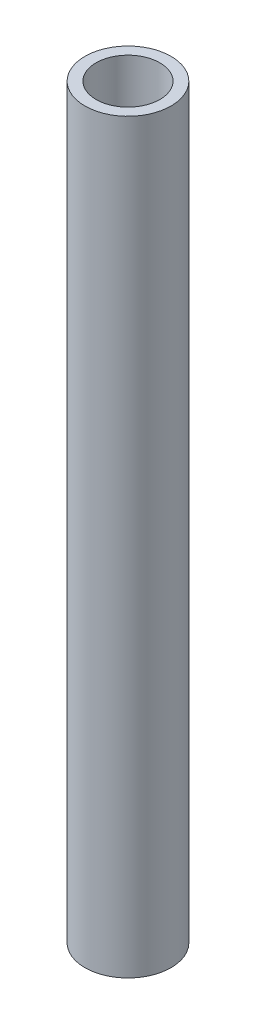
ISO-10303-21;
HEADER;
FILE_DESCRIPTION(('STEP AP214'),'2;1');
FILE_NAME('part.step','',(''),(''),'','','');
FILE_SCHEMA(('AUTOMOTIVE_DESIGN { 1 0 10303 214 1 1 1 1 }'));
ENDSEC;
DATA;
#1=APPLICATION_CONTEXT('core data for automotive mechanical design processes');
#2=APPLICATION_PROTOCOL_DEFINITION('international standard','automotive_design',2000,#1);
#3=PRODUCT_CONTEXT('',#1,'mechanical');
#4=PRODUCT('Part','Part','',(#3));
#5=PRODUCT_RELATED_PRODUCT_CATEGORY('part','',(#4));
#6=PRODUCT_DEFINITION_FORMATION('','',#4);
#7=PRODUCT_DEFINITION_CONTEXT('part definition',#1,'design');
#8=PRODUCT_DEFINITION('design','',#6,#7);
#9=PRODUCT_DEFINITION_SHAPE('','',#8);
#10=(LENGTH_UNIT() NAMED_UNIT(*) SI_UNIT(.MILLI.,.METRE.));
#11=(NAMED_UNIT(*) PLANE_ANGLE_UNIT() SI_UNIT($,.RADIAN.));
#12=(NAMED_UNIT(*) SI_UNIT($,.STERADIAN.) SOLID_ANGLE_UNIT());
#13=UNCERTAINTY_MEASURE_WITH_UNIT(LENGTH_MEASURE(1.E-05),#10,'distance_accuracy_value','');
#14=(GEOMETRIC_REPRESENTATION_CONTEXT(3) GLOBAL_UNCERTAINTY_ASSIGNED_CONTEXT((#13)) GLOBAL_UNIT_ASSIGNED_CONTEXT((#10,
#11,#12)) REPRESENTATION_CONTEXT('',''));
#15=CARTESIAN_POINT('',(0.,0.,0.));
#16=DIRECTION('',(0.,0.,1.));
#17=DIRECTION('',(1.,0.,0.));
#18=AXIS2_PLACEMENT_3D('',#15,#16,#17);
#19=CARTESIAN_POINT('',(0.,184.94375,0.));
#20=DIRECTION('',(0.,1.,0.));
#21=DIRECTION('',(0.,0.,1.));
#22=AXIS2_PLACEMENT_3D('',#19,#20,#21);
#23=PLANE('',#22);
#24=CARTESIAN_POINT('',(0.,184.94375,0.));
#25=DIRECTION('',(0.,1.,0.));
#26=DIRECTION('',(0.,0.,1.));
#27=AXIS2_PLACEMENT_3D('',#24,#25,#26);
#28=CIRCLE('',#27,10.668);
#29=CARTESIAN_POINT('',(0.,184.94375,10.668));
#30=VERTEX_POINT('',#29);
#31=EDGE_CURVE('E10',#30,#30,#28,.T.);
#32=ORIENTED_EDGE('',*,*,#31,.T.);
#33=EDGE_LOOP('',(#32));
#34=FACE_BOUND('',#33,.T.);
#35=CARTESIAN_POINT('',(0.,184.94375,0.));
#36=DIRECTION('',(0.,1.,0.));
#37=DIRECTION('',(0.,0.,1.));
#38=AXIS2_PLACEMENT_3D('',#35,#36,#37);
#39=CIRCLE('',#38,7.8994);
#40=CARTESIAN_POINT('',(0.,184.94375,7.8994));
#41=VERTEX_POINT('',#40);
#42=EDGE_CURVE('E50',#41,#41,#39,.T.);
#43=ORIENTED_EDGE('',*,*,#42,.F.);
#44=EDGE_LOOP('',(#43));
#45=FACE_BOUND('',#44,.T.);
#46=ADVANCED_FACE('F37',(#34,#45),#23,.T.);
#47=CARTESIAN_POINT('',(0.,0.,0.));
#48=DIRECTION('',(0.,1.,0.));
#49=DIRECTION('',(0.,0.,1.));
#50=AXIS2_PLACEMENT_3D('',#47,#48,#49);
#51=PLANE('',#50);
#52=CARTESIAN_POINT('',(0.,0.,0.));
#53=DIRECTION('',(0.,1.,0.));
#54=DIRECTION('',(0.,0.,1.));
#55=AXIS2_PLACEMENT_3D('',#52,#53,#54);
#56=CIRCLE('',#55,10.668);
#57=CARTESIAN_POINT('',(0.,0.,10.668));
#58=VERTEX_POINT('',#57);
#59=EDGE_CURVE('E41',#58,#58,#56,.T.);
#60=ORIENTED_EDGE('',*,*,#59,.F.);
#61=EDGE_LOOP('',(#60));
#62=FACE_BOUND('',#61,.T.);
#63=CARTESIAN_POINT('',(0.,0.,0.));
#64=DIRECTION('',(0.,1.,0.));
#65=DIRECTION('',(0.,0.,1.));
#66=AXIS2_PLACEMENT_3D('',#63,#64,#65);
#67=CIRCLE('',#66,7.8994);
#68=CARTESIAN_POINT('',(0.,0.,7.8994));
#69=VERTEX_POINT('',#68);
#70=EDGE_CURVE('E52',#69,#69,#67,.T.);
#71=ORIENTED_EDGE('',*,*,#70,.T.);
#72=EDGE_LOOP('',(#71));
#73=FACE_BOUND('',#72,.T.);
#74=ADVANCED_FACE('F64',(#62,#73),#51,.F.);
#75=CARTESIAN_POINT('',(0.,184.94375,0.));
#76=DIRECTION('',(0.,-1.,0.));
#77=DIRECTION('',(0.,0.,-1.));
#78=AXIS2_PLACEMENT_3D('',#75,#76,#77);
#79=CYLINDRICAL_SURFACE('',#78,10.668);
#80=ORIENTED_EDGE('',*,*,#31,.F.);
#81=EDGE_LOOP('',(#80));
#82=FACE_BOUND('',#81,.T.);
#83=ORIENTED_EDGE('',*,*,#59,.T.);
#84=EDGE_LOOP('',(#83));
#85=FACE_BOUND('',#84,.T.);
#86=ADVANCED_FACE('F39',(#82,#85),#79,.T.);
#87=CARTESIAN_POINT('',(0.,184.94375,0.));
#88=DIRECTION('',(0.,-1.,0.));
#89=DIRECTION('',(0.,0.,-1.));
#90=AXIS2_PLACEMENT_3D('',#87,#88,#89);
#91=CYLINDRICAL_SURFACE('',#90,7.8994);
#92=ORIENTED_EDGE('',*,*,#42,.T.);
#93=EDGE_LOOP('',(#92));
#94=FACE_BOUND('',#93,.T.);
#95=ORIENTED_EDGE('',*,*,#70,.F.);
#96=EDGE_LOOP('',(#95));
#97=FACE_BOUND('',#96,.T.);
#98=ADVANCED_FACE('F60',(#94,#97),#91,.F.);
#99=CLOSED_SHELL('',(#46,#74,#86,#98));
#100=MANIFOLD_SOLID_BREP('B2',#99);
#101=ADVANCED_BREP_SHAPE_REPRESENTATION('',(#18,#100),#14);
#102=SHAPE_DEFINITION_REPRESENTATION(#9,#101);
ENDSEC;
END-ISO-10303-21;
